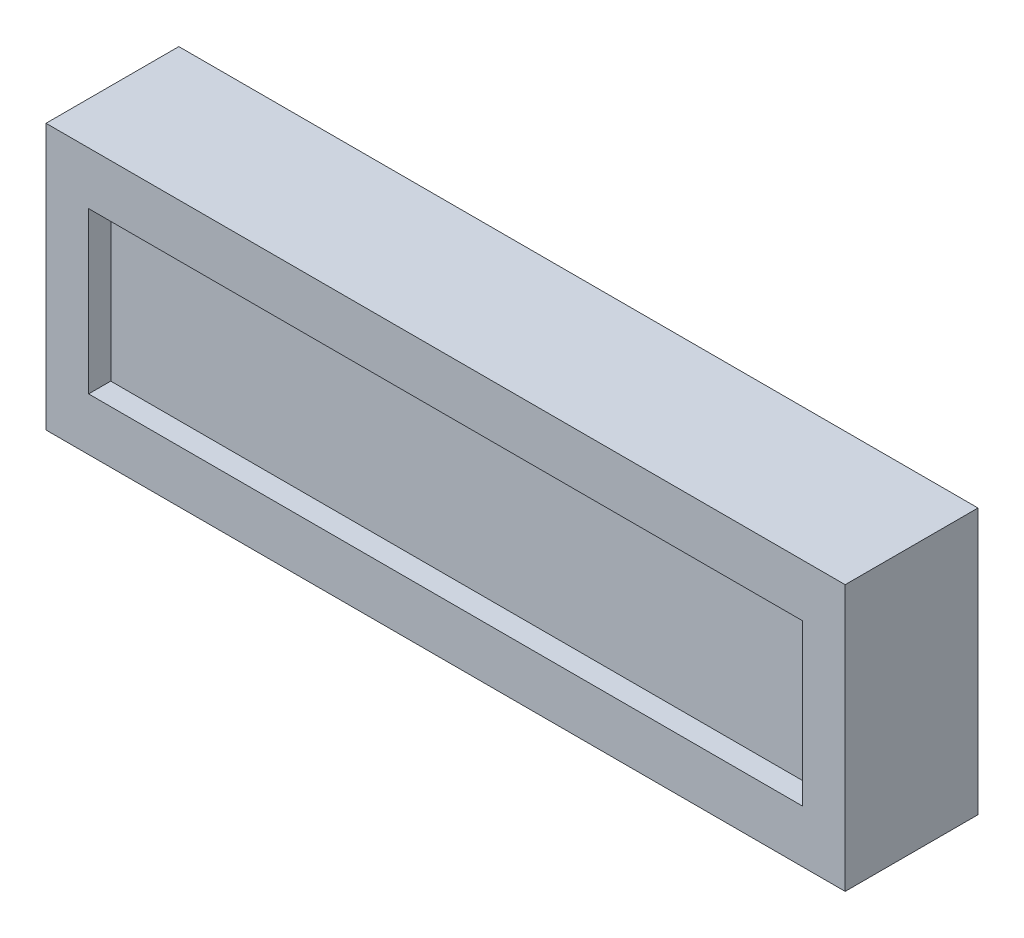
ISO-10303-21;
HEADER;
FILE_DESCRIPTION(('STEP AP214'),'2;1');
FILE_NAME('part.step','',(''),(''),'','','');
FILE_SCHEMA(('AUTOMOTIVE_DESIGN { 1 0 10303 214 1 1 1 1 }'));
ENDSEC;
DATA;
#1=APPLICATION_CONTEXT('core data for automotive mechanical design processes');
#2=APPLICATION_PROTOCOL_DEFINITION('international standard','automotive_design',2000,#1);
#3=PRODUCT_CONTEXT('',#1,'mechanical');
#4=PRODUCT('Part','Part','',(#3));
#5=PRODUCT_RELATED_PRODUCT_CATEGORY('part','',(#4));
#6=PRODUCT_DEFINITION_FORMATION('','',#4);
#7=PRODUCT_DEFINITION_CONTEXT('part definition',#1,'design');
#8=PRODUCT_DEFINITION('design','',#6,#7);
#9=PRODUCT_DEFINITION_SHAPE('','',#8);
#10=(LENGTH_UNIT() NAMED_UNIT(*) SI_UNIT(.MILLI.,.METRE.));
#11=(NAMED_UNIT(*) PLANE_ANGLE_UNIT() SI_UNIT($,.RADIAN.));
#12=(NAMED_UNIT(*) SI_UNIT($,.STERADIAN.) SOLID_ANGLE_UNIT());
#13=UNCERTAINTY_MEASURE_WITH_UNIT(LENGTH_MEASURE(1.E-05),#10,'distance_accuracy_value','');
#14=(GEOMETRIC_REPRESENTATION_CONTEXT(3) GLOBAL_UNCERTAINTY_ASSIGNED_CONTEXT((#13)) GLOBAL_UNIT_ASSIGNED_CONTEXT((#10,
#11,#12)) REPRESENTATION_CONTEXT('',''));
#15=CARTESIAN_POINT('',(0.,0.,0.));
#16=DIRECTION('',(0.,0.,1.));
#17=DIRECTION('',(1.,0.,0.));
#18=AXIS2_PLACEMENT_3D('',#15,#16,#17);
#19=CARTESIAN_POINT('',(0.,0.,10.));
#20=DIRECTION('',(0.,0.,1.));
#21=DIRECTION('',(1.,0.,0.));
#22=AXIS2_PLACEMENT_3D('',#19,#20,#21);
#23=PLANE('',#22);
#24=DIRECTION('',(0.,1.,0.));
#25=VECTOR('',#24,1.);
#26=CARTESIAN_POINT('',(32.25,-7.25,10.));
#27=LINE('',#26,#25);
#28=CARTESIAN_POINT('',(32.25,-7.25,10.));
#29=VERTEX_POINT('',#28);
#30=CARTESIAN_POINT('',(32.25,7.25,10.));
#31=VERTEX_POINT('',#30);
#32=EDGE_CURVE('E96',#29,#31,#27,.T.);
#33=ORIENTED_EDGE('',*,*,#32,.T.);
#34=DIRECTION('',(1.,0.,0.));
#35=VECTOR('',#34,1.);
#36=CARTESIAN_POINT('',(32.25,7.25,10.));
#37=LINE('',#36,#35);
#38=CARTESIAN_POINT('',(-32.25,7.25,10.));
#39=VERTEX_POINT('',#38);
#40=EDGE_CURVE('E79',#31,#39,#37,.F.);
#41=ORIENTED_EDGE('',*,*,#40,.T.);
#42=DIRECTION('',(0.,1.,0.));
#43=VECTOR('',#42,1.);
#44=CARTESIAN_POINT('',(-32.25,7.25,10.));
#45=LINE('',#44,#43);
#46=CARTESIAN_POINT('',(-32.25,-7.25,10.));
#47=VERTEX_POINT('',#46);
#48=EDGE_CURVE('E20',#39,#47,#45,.F.);
#49=ORIENTED_EDGE('',*,*,#48,.T.);
#50=DIRECTION('',(1.,0.,0.));
#51=VECTOR('',#50,1.);
#52=CARTESIAN_POINT('',(-32.25,-7.25,10.));
#53=LINE('',#52,#51);
#54=EDGE_CURVE('E106',#47,#29,#53,.T.);
#55=ORIENTED_EDGE('',*,*,#54,.T.);
#56=EDGE_LOOP('',(#33,#41,#49,#55));
#57=FACE_BOUND('',#56,.T.);
#58=ADVANCED_FACE('F17',(#57),#23,.T.);
#59=CARTESIAN_POINT('',(-32.25,7.25,0.));
#60=DIRECTION('',(-1.,0.,0.));
#61=DIRECTION('',(0.,0.,1.));
#62=AXIS2_PLACEMENT_3D('',#59,#60,#61);
#63=PLANE('',#62);
#64=DIRECTION('',(0.,0.,1.));
#65=VECTOR('',#64,1.);
#66=CARTESIAN_POINT('',(-32.25,7.25,0.));
#67=LINE('',#66,#65);
#68=CARTESIAN_POINT('',(-32.25,7.25,12.));
#69=VERTEX_POINT('',#68);
#70=EDGE_CURVE('E87',#39,#69,#67,.T.);
#71=ORIENTED_EDGE('',*,*,#70,.T.);
#72=DIRECTION('',(0.,1.,0.));
#73=VECTOR('',#72,1.);
#74=CARTESIAN_POINT('',(-32.25,0.,12.));
#75=LINE('',#74,#73);
#76=CARTESIAN_POINT('',(-32.25,-7.25,12.));
#77=VERTEX_POINT('',#76);
#78=EDGE_CURVE('E108',#77,#69,#75,.T.);
#79=ORIENTED_EDGE('',*,*,#78,.F.);
#80=DIRECTION('',(0.,0.,-1.));
#81=VECTOR('',#80,1.);
#82=CARTESIAN_POINT('',(-32.25,-7.25,0.));
#83=LINE('',#82,#81);
#84=EDGE_CURVE('E89',#77,#47,#83,.T.);
#85=ORIENTED_EDGE('',*,*,#84,.T.);
#86=ORIENTED_EDGE('',*,*,#48,.F.);
#87=EDGE_LOOP('',(#71,#79,#85,#86));
#88=FACE_BOUND('',#87,.T.);
#89=ADVANCED_FACE('F85',(#88),#63,.F.);
#90=CARTESIAN_POINT('',(32.25,7.25,0.));
#91=DIRECTION('',(0.,1.,0.));
#92=DIRECTION('',(0.,0.,1.));
#93=AXIS2_PLACEMENT_3D('',#90,#91,#92);
#94=PLANE('',#93);
#95=DIRECTION('',(0.,0.,-1.));
#96=VECTOR('',#95,1.);
#97=CARTESIAN_POINT('',(32.25,7.25,0.));
#98=LINE('',#97,#96);
#99=CARTESIAN_POINT('',(32.25,7.25,12.));
#100=VERTEX_POINT('',#99);
#101=EDGE_CURVE('E97',#31,#100,#98,.F.);
#102=ORIENTED_EDGE('',*,*,#101,.T.);
#103=DIRECTION('',(1.,0.,0.));
#104=VECTOR('',#103,1.);
#105=CARTESIAN_POINT('',(0.,7.25,12.));
#106=LINE('',#105,#104);
#107=EDGE_CURVE('E94',#69,#100,#106,.T.);
#108=ORIENTED_EDGE('',*,*,#107,.F.);
#109=ORIENTED_EDGE('',*,*,#70,.F.);
#110=ORIENTED_EDGE('',*,*,#40,.F.);
#111=EDGE_LOOP('',(#102,#108,#109,#110));
#112=FACE_BOUND('',#111,.T.);
#113=ADVANCED_FACE('F93',(#112),#94,.F.);
#114=CARTESIAN_POINT('',(32.25,-7.25,0.));
#115=DIRECTION('',(1.,0.,0.));
#116=DIRECTION('',(0.,0.,-1.));
#117=AXIS2_PLACEMENT_3D('',#114,#115,#116);
#118=PLANE('',#117);
#119=DIRECTION('',(0.,0.,-1.));
#120=VECTOR('',#119,1.);
#121=CARTESIAN_POINT('',(32.25,-7.25,0.));
#122=LINE('',#121,#120);
#123=CARTESIAN_POINT('',(32.25,-7.25,12.));
#124=VERTEX_POINT('',#123);
#125=EDGE_CURVE('E102',#29,#124,#122,.F.);
#126=ORIENTED_EDGE('',*,*,#125,.T.);
#127=DIRECTION('',(0.,1.,0.));
#128=VECTOR('',#127,1.);
#129=CARTESIAN_POINT('',(32.25,0.,12.));
#130=LINE('',#129,#128);
#131=EDGE_CURVE('E111',#100,#124,#130,.F.);
#132=ORIENTED_EDGE('',*,*,#131,.F.);
#133=ORIENTED_EDGE('',*,*,#101,.F.);
#134=ORIENTED_EDGE('',*,*,#32,.F.);
#135=EDGE_LOOP('',(#126,#132,#133,#134));
#136=FACE_BOUND('',#135,.T.);
#137=ADVANCED_FACE('F178',(#136),#118,.F.);
#138=CARTESIAN_POINT('',(-32.25,-7.25,0.));
#139=DIRECTION('',(0.,-1.,0.));
#140=DIRECTION('',(0.,0.,-1.));
#141=AXIS2_PLACEMENT_3D('',#138,#139,#140);
#142=PLANE('',#141);
#143=ORIENTED_EDGE('',*,*,#84,.F.);
#144=DIRECTION('',(1.,0.,0.));
#145=VECTOR('',#144,1.);
#146=CARTESIAN_POINT('',(0.,-7.25,12.));
#147=LINE('',#146,#145);
#148=EDGE_CURVE('E113',#124,#77,#147,.F.);
#149=ORIENTED_EDGE('',*,*,#148,.F.);
#150=ORIENTED_EDGE('',*,*,#125,.F.);
#151=ORIENTED_EDGE('',*,*,#54,.F.);
#152=EDGE_LOOP('',(#143,#149,#150,#151));
#153=FACE_BOUND('',#152,.T.);
#154=ADVANCED_FACE('F174',(#153),#142,.F.);
#155=CARTESIAN_POINT('',(0.,0.,12.));
#156=DIRECTION('',(0.,0.,1.));
#157=DIRECTION('',(1.,0.,0.));
#158=AXIS2_PLACEMENT_3D('',#155,#156,#157);
#159=PLANE('',#158);
#160=ORIENTED_EDGE('',*,*,#131,.T.);
#161=ORIENTED_EDGE('',*,*,#148,.T.);
#162=ORIENTED_EDGE('',*,*,#78,.T.);
#163=ORIENTED_EDGE('',*,*,#107,.T.);
#164=EDGE_LOOP('',(#160,#161,#162,#163));
#165=FACE_BOUND('',#164,.T.);
#166=DIRECTION('',(1.,0.,0.));
#167=VECTOR('',#166,1.);
#168=CARTESIAN_POINT('',(36.1,12.,12.));
#169=LINE('',#168,#167);
#170=CARTESIAN_POINT('',(-36.1,12.,12.));
#171=VERTEX_POINT('',#170);
#172=CARTESIAN_POINT('',(36.1,12.,12.));
#173=VERTEX_POINT('',#172);
#174=EDGE_CURVE('E118',#171,#173,#169,.T.);
#175=ORIENTED_EDGE('',*,*,#174,.F.);
#176=DIRECTION('',(0.,1.,0.));
#177=VECTOR('',#176,1.);
#178=CARTESIAN_POINT('',(-36.1,12.,12.));
#179=LINE('',#178,#177);
#180=CARTESIAN_POINT('',(-36.1,-12.,12.));
#181=VERTEX_POINT('',#180);
#182=EDGE_CURVE('E122',#181,#171,#179,.T.);
#183=ORIENTED_EDGE('',*,*,#182,.F.);
#184=DIRECTION('',(1.,0.,0.));
#185=VECTOR('',#184,1.);
#186=CARTESIAN_POINT('',(-36.1,-12.,12.));
#187=LINE('',#186,#185);
#188=CARTESIAN_POINT('',(36.1,-12.,12.));
#189=VERTEX_POINT('',#188);
#190=EDGE_CURVE('E129',#189,#181,#187,.F.);
#191=ORIENTED_EDGE('',*,*,#190,.F.);
#192=DIRECTION('',(0.,1.,0.));
#193=VECTOR('',#192,1.);
#194=CARTESIAN_POINT('',(36.1,-12.,12.));
#195=LINE('',#194,#193);
#196=EDGE_CURVE('E116',#173,#189,#195,.F.);
#197=ORIENTED_EDGE('',*,*,#196,.F.);
#198=EDGE_LOOP('',(#175,#183,#191,#197));
#199=FACE_BOUND('',#198,.T.);
#200=ADVANCED_FACE('F171',(#165,#199),#159,.T.);
#201=CARTESIAN_POINT('',(36.1,-12.,0.));
#202=DIRECTION('',(1.,0.,0.));
#203=DIRECTION('',(0.,0.,-1.));
#204=AXIS2_PLACEMENT_3D('',#201,#202,#203);
#205=PLANE('',#204);
#206=ORIENTED_EDGE('',*,*,#196,.T.);
#207=DIRECTION('',(0.,0.,-1.));
#208=VECTOR('',#207,1.);
#209=CARTESIAN_POINT('',(36.1,-12.,0.));
#210=LINE('',#209,#208);
#211=CARTESIAN_POINT('',(36.1,-12.,0.));
#212=VERTEX_POINT('',#211);
#213=EDGE_CURVE('E126',#212,#189,#210,.F.);
#214=ORIENTED_EDGE('',*,*,#213,.F.);
#215=DIRECTION('',(0.,1.,0.));
#216=VECTOR('',#215,1.);
#217=CARTESIAN_POINT('',(36.1,0.,0.));
#218=LINE('',#217,#216);
#219=CARTESIAN_POINT('',(36.1,12.,0.));
#220=VERTEX_POINT('',#219);
#221=EDGE_CURVE('E132',#212,#220,#218,.T.);
#222=ORIENTED_EDGE('',*,*,#221,.T.);
#223=DIRECTION('',(0.,0.,1.));
#224=VECTOR('',#223,1.);
#225=CARTESIAN_POINT('',(36.1,12.,0.));
#226=LINE('',#225,#224);
#227=EDGE_CURVE('E120',#173,#220,#226,.F.);
#228=ORIENTED_EDGE('',*,*,#227,.F.);
#229=EDGE_LOOP('',(#206,#214,#222,#228));
#230=FACE_BOUND('',#229,.T.);
#231=ADVANCED_FACE('F152',(#230),#205,.T.);
#232=CARTESIAN_POINT('',(36.1,12.,0.));
#233=DIRECTION('',(0.,1.,0.));
#234=DIRECTION('',(0.,0.,1.));
#235=AXIS2_PLACEMENT_3D('',#232,#233,#234);
#236=PLANE('',#235);
#237=ORIENTED_EDGE('',*,*,#174,.T.);
#238=ORIENTED_EDGE('',*,*,#227,.T.);
#239=DIRECTION('',(1.,0.,0.));
#240=VECTOR('',#239,1.);
#241=CARTESIAN_POINT('',(0.,12.,0.));
#242=LINE('',#241,#240);
#243=CARTESIAN_POINT('',(-36.1,12.,0.));
#244=VERTEX_POINT('',#243);
#245=EDGE_CURVE('E135',#220,#244,#242,.F.);
#246=ORIENTED_EDGE('',*,*,#245,.T.);
#247=DIRECTION('',(0.,0.,1.));
#248=VECTOR('',#247,1.);
#249=CARTESIAN_POINT('',(-36.1,12.,0.));
#250=LINE('',#249,#248);
#251=EDGE_CURVE('E124',#171,#244,#250,.F.);
#252=ORIENTED_EDGE('',*,*,#251,.F.);
#253=EDGE_LOOP('',(#237,#238,#246,#252));
#254=FACE_BOUND('',#253,.T.);
#255=ADVANCED_FACE('F147',(#254),#236,.T.);
#256=CARTESIAN_POINT('',(-36.1,12.,0.));
#257=DIRECTION('',(-1.,0.,0.));
#258=DIRECTION('',(0.,0.,1.));
#259=AXIS2_PLACEMENT_3D('',#256,#257,#258);
#260=PLANE('',#259);
#261=ORIENTED_EDGE('',*,*,#182,.T.);
#262=ORIENTED_EDGE('',*,*,#251,.T.);
#263=DIRECTION('',(0.,1.,0.));
#264=VECTOR('',#263,1.);
#265=CARTESIAN_POINT('',(-36.1,0.,0.));
#266=LINE('',#265,#264);
#267=CARTESIAN_POINT('',(-36.1,-12.,0.));
#268=VERTEX_POINT('',#267);
#269=EDGE_CURVE('E26',#244,#268,#266,.F.);
#270=ORIENTED_EDGE('',*,*,#269,.T.);
#271=DIRECTION('',(0.,0.,-1.));
#272=VECTOR('',#271,1.);
#273=CARTESIAN_POINT('',(-36.1,-12.,0.));
#274=LINE('',#273,#272);
#275=EDGE_CURVE('E34',#181,#268,#274,.T.);
#276=ORIENTED_EDGE('',*,*,#275,.F.);
#277=EDGE_LOOP('',(#261,#262,#270,#276));
#278=FACE_BOUND('',#277,.T.);
#279=ADVANCED_FACE('F141',(#278),#260,.T.);
#280=CARTESIAN_POINT('',(-36.1,-12.,0.));
#281=DIRECTION('',(0.,-1.,0.));
#282=DIRECTION('',(0.,0.,-1.));
#283=AXIS2_PLACEMENT_3D('',#280,#281,#282);
#284=PLANE('',#283);
#285=ORIENTED_EDGE('',*,*,#190,.T.);
#286=ORIENTED_EDGE('',*,*,#275,.T.);
#287=DIRECTION('',(1.,0.,0.));
#288=VECTOR('',#287,1.);
#289=CARTESIAN_POINT('',(0.,-12.,0.));
#290=LINE('',#289,#288);
#291=EDGE_CURVE('E11',#268,#212,#290,.T.);
#292=ORIENTED_EDGE('',*,*,#291,.T.);
#293=ORIENTED_EDGE('',*,*,#213,.T.);
#294=EDGE_LOOP('',(#285,#286,#292,#293));
#295=FACE_BOUND('',#294,.T.);
#296=ADVANCED_FACE('F155',(#295),#284,.T.);
#297=CARTESIAN_POINT('',(0.,0.,0.));
#298=DIRECTION('',(0.,0.,1.));
#299=DIRECTION('',(1.,0.,0.));
#300=AXIS2_PLACEMENT_3D('',#297,#298,#299);
#301=PLANE('',#300);
#302=ORIENTED_EDGE('',*,*,#269,.F.);
#303=ORIENTED_EDGE('',*,*,#245,.F.);
#304=ORIENTED_EDGE('',*,*,#221,.F.);
#305=ORIENTED_EDGE('',*,*,#291,.F.);
#306=EDGE_LOOP('',(#302,#303,#304,#305));
#307=FACE_BOUND('',#306,.T.);
#308=ADVANCED_FACE('F145',(#307),#301,.F.);
#309=CLOSED_SHELL('',(#58,#89,#113,#137,#154,#200,#231,#255,#279,#296,#308));
#310=MANIFOLD_SOLID_BREP('B1',#309);
#311=ADVANCED_BREP_SHAPE_REPRESENTATION('',(#18,#310),#14);
#312=SHAPE_DEFINITION_REPRESENTATION(#9,#311);
ENDSEC;
END-ISO-10303-21;
